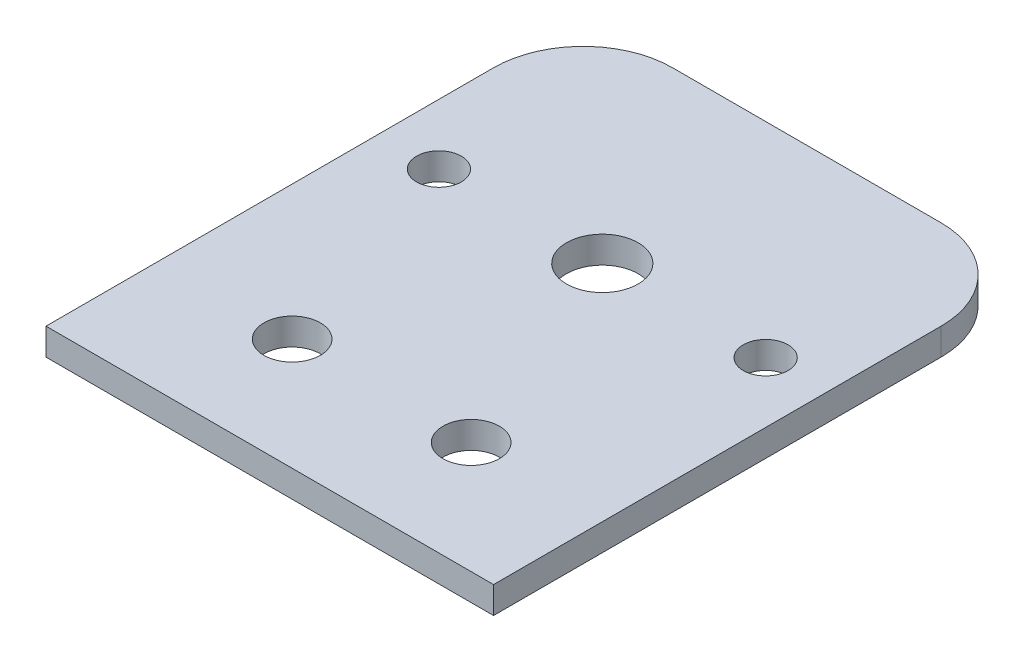
ISO-10303-21;
HEADER;
FILE_DESCRIPTION(('STEP AP214'),'2;1');
FILE_NAME('part.step','',(''),(''),'','','');
FILE_SCHEMA(('AUTOMOTIVE_DESIGN { 1 0 10303 214 1 1 1 1 }'));
ENDSEC;
DATA;
#1=APPLICATION_CONTEXT('core data for automotive mechanical design processes');
#2=APPLICATION_PROTOCOL_DEFINITION('international standard','automotive_design',2000,#1);
#3=PRODUCT_CONTEXT('',#1,'mechanical');
#4=PRODUCT('Part','Part','',(#3));
#5=PRODUCT_RELATED_PRODUCT_CATEGORY('part','',(#4));
#6=PRODUCT_DEFINITION_FORMATION('','',#4);
#7=PRODUCT_DEFINITION_CONTEXT('part definition',#1,'design');
#8=PRODUCT_DEFINITION('design','',#6,#7);
#9=PRODUCT_DEFINITION_SHAPE('','',#8);
#10=(LENGTH_UNIT() NAMED_UNIT(*) SI_UNIT(.MILLI.,.METRE.));
#11=(NAMED_UNIT(*) PLANE_ANGLE_UNIT() SI_UNIT($,.RADIAN.));
#12=(NAMED_UNIT(*) SI_UNIT($,.STERADIAN.) SOLID_ANGLE_UNIT());
#13=UNCERTAINTY_MEASURE_WITH_UNIT(LENGTH_MEASURE(1.E-05),#10,'distance_accuracy_value','');
#14=(GEOMETRIC_REPRESENTATION_CONTEXT(3) GLOBAL_UNCERTAINTY_ASSIGNED_CONTEXT((#13)) GLOBAL_UNIT_ASSIGNED_CONTEXT((#10,
#11,#12)) REPRESENTATION_CONTEXT('',''));
#15=CARTESIAN_POINT('',(0.,0.,0.));
#16=DIRECTION('',(0.,0.,1.));
#17=DIRECTION('',(1.,0.,0.));
#18=AXIS2_PLACEMENT_3D('',#15,#16,#17);
#19=CARTESIAN_POINT('',(15.,3.,-12.85));
#20=DIRECTION('',(0.,1.,0.));
#21=DIRECTION('',(0.,0.,1.));
#22=AXIS2_PLACEMENT_3D('',#19,#20,#21);
#23=PLANE('',#22);
#24=CARTESIAN_POINT('',(-18.25,3.,0.));
#25=DIRECTION('',(0.,1.,0.));
#26=DIRECTION('',(0.,0.,-1.));
#27=AXIS2_PLACEMENT_3D('',#24,#25,#26);
#28=CIRCLE('',#27,2.5);
#29=CARTESIAN_POINT('',(-18.25,3.,-2.5));
#30=VERTEX_POINT('',#29);
#31=EDGE_CURVE('E196',#30,#30,#28,.T.);
#32=ORIENTED_EDGE('',*,*,#31,.F.);
#33=EDGE_LOOP('',(#32));
#34=FACE_BOUND('',#33,.T.);
#35=CARTESIAN_POINT('',(18.25,3.,0.));
#36=DIRECTION('',(0.,1.,0.));
#37=DIRECTION('',(0.,0.,1.));
#38=AXIS2_PLACEMENT_3D('',#35,#36,#37);
#39=CIRCLE('',#38,2.5);
#40=CARTESIAN_POINT('',(18.25,3.,2.5));
#41=VERTEX_POINT('',#40);
#42=EDGE_CURVE('E208',#41,#41,#39,.T.);
#43=ORIENTED_EDGE('',*,*,#42,.F.);
#44=EDGE_LOOP('',(#43));
#45=FACE_BOUND('',#44,.T.);
#46=DIRECTION('',(0.,0.,-1.));
#47=VECTOR('',#46,1.);
#48=CARTESIAN_POINT('',(25.,3.,37.15));
#49=LINE('',#48,#47);
#50=CARTESIAN_POINT('',(25.,3.,37.15));
#51=VERTEX_POINT('',#50);
#52=CARTESIAN_POINT('',(25.,3.,-12.85));
#53=VERTEX_POINT('',#52);
#54=EDGE_CURVE('E132',#51,#53,#49,.T.);
#55=ORIENTED_EDGE('',*,*,#54,.T.);
#56=CARTESIAN_POINT('',(15.,3.,-12.85));
#57=DIRECTION('',(0.,1.,0.));
#58=DIRECTION('',(0.,0.,1.));
#59=AXIS2_PLACEMENT_3D('',#56,#57,#58);
#60=CIRCLE('',#59,10.);
#61=CARTESIAN_POINT('',(15.,3.,-22.85));
#62=VERTEX_POINT('',#61);
#63=EDGE_CURVE('E90',#53,#62,#60,.T.);
#64=ORIENTED_EDGE('',*,*,#63,.T.);
#65=DIRECTION('',(-1.,0.,0.));
#66=VECTOR('',#65,1.);
#67=CARTESIAN_POINT('',(15.,3.,-22.85));
#68=LINE('',#67,#66);
#69=CARTESIAN_POINT('',(-15.,3.,-22.85));
#70=VERTEX_POINT('',#69);
#71=EDGE_CURVE('E103',#62,#70,#68,.T.);
#72=ORIENTED_EDGE('',*,*,#71,.T.);
#73=CARTESIAN_POINT('',(-15.,3.,-12.85));
#74=DIRECTION('',(0.,1.,0.));
#75=DIRECTION('',(0.,0.,1.));
#76=AXIS2_PLACEMENT_3D('',#73,#74,#75);
#77=CIRCLE('',#76,10.);
#78=CARTESIAN_POINT('',(-25.,3.,-12.85));
#79=VERTEX_POINT('',#78);
#80=EDGE_CURVE('E97',#70,#79,#77,.T.);
#81=ORIENTED_EDGE('',*,*,#80,.T.);
#82=DIRECTION('',(0.,0.,1.));
#83=VECTOR('',#82,1.);
#84=CARTESIAN_POINT('',(-25.,3.,37.15));
#85=LINE('',#84,#83);
#86=CARTESIAN_POINT('',(-25.,3.,37.15));
#87=VERTEX_POINT('',#86);
#88=EDGE_CURVE('E101',#79,#87,#85,.T.);
#89=ORIENTED_EDGE('',*,*,#88,.T.);
#90=DIRECTION('',(1.,0.,0.));
#91=VECTOR('',#90,1.);
#92=CARTESIAN_POINT('',(25.,3.,37.15));
#93=LINE('',#92,#91);
#94=EDGE_CURVE('E53',#87,#51,#93,.T.);
#95=ORIENTED_EDGE('',*,*,#94,.T.);
#96=EDGE_LOOP('',(#55,#64,#72,#81,#89,#95));
#97=FACE_BOUND('',#96,.T.);
#98=CARTESIAN_POINT('',(0.,3.,0.));
#99=DIRECTION('',(0.,1.,0.));
#100=DIRECTION('',(0.,0.,1.));
#101=AXIS2_PLACEMENT_3D('',#98,#99,#100);
#102=CIRCLE('',#101,4.);
#103=CARTESIAN_POINT('',(0.,3.,4.));
#104=VERTEX_POINT('',#103);
#105=EDGE_CURVE('E125',#104,#104,#102,.T.);
#106=ORIENTED_EDGE('',*,*,#105,.F.);
#107=EDGE_LOOP('',(#106));
#108=FACE_BOUND('',#107,.T.);
#109=CARTESIAN_POINT('',(-10.,3.,24.65));
#110=DIRECTION('',(0.,1.,0.));
#111=DIRECTION('',(0.,0.,1.));
#112=AXIS2_PLACEMENT_3D('',#109,#110,#111);
#113=CIRCLE('',#112,3.15);
#114=CARTESIAN_POINT('',(-10.,3.,27.8));
#115=VERTEX_POINT('',#114);
#116=EDGE_CURVE('E202',#115,#115,#113,.T.);
#117=ORIENTED_EDGE('',*,*,#116,.F.);
#118=EDGE_LOOP('',(#117));
#119=FACE_BOUND('',#118,.T.);
#120=CARTESIAN_POINT('',(10.,3.,24.65));
#121=DIRECTION('',(0.,1.,0.));
#122=DIRECTION('',(0.,0.,-1.));
#123=AXIS2_PLACEMENT_3D('',#120,#121,#122);
#124=CIRCLE('',#123,3.15);
#125=CARTESIAN_POINT('',(10.,3.,21.5));
#126=VERTEX_POINT('',#125);
#127=EDGE_CURVE('E187',#126,#126,#124,.T.);
#128=ORIENTED_EDGE('',*,*,#127,.F.);
#129=EDGE_LOOP('',(#128));
#130=FACE_BOUND('',#129,.T.);
#131=ADVANCED_FACE('F36',(#34,#45,#97,#108,#119,#130),#23,.T.);
#132=CARTESIAN_POINT('',(15.,0.,-12.85));
#133=DIRECTION('',(0.,1.,0.));
#134=DIRECTION('',(0.,0.,1.));
#135=AXIS2_PLACEMENT_3D('',#132,#133,#134);
#136=PLANE('',#135);
#137=DIRECTION('',(0.,0.,-1.));
#138=VECTOR('',#137,1.);
#139=CARTESIAN_POINT('',(25.,0.,37.15));
#140=LINE('',#139,#138);
#141=CARTESIAN_POINT('',(25.,0.,37.15));
#142=VERTEX_POINT('',#141);
#143=CARTESIAN_POINT('',(25.,0.,-12.85));
#144=VERTEX_POINT('',#143);
#145=EDGE_CURVE('E121',#142,#144,#140,.T.);
#146=ORIENTED_EDGE('',*,*,#145,.F.);
#147=DIRECTION('',(1.,0.,0.));
#148=VECTOR('',#147,1.);
#149=CARTESIAN_POINT('',(25.,0.,37.15));
#150=LINE('',#149,#148);
#151=CARTESIAN_POINT('',(-25.,0.,37.15));
#152=VERTEX_POINT('',#151);
#153=EDGE_CURVE('E82',#152,#142,#150,.T.);
#154=ORIENTED_EDGE('',*,*,#153,.F.);
#155=DIRECTION('',(0.,0.,1.));
#156=VECTOR('',#155,1.);
#157=CARTESIAN_POINT('',(-25.,0.,37.15));
#158=LINE('',#157,#156);
#159=CARTESIAN_POINT('',(-25.,0.,-12.85));
#160=VERTEX_POINT('',#159);
#161=EDGE_CURVE('E76',#160,#152,#158,.T.);
#162=ORIENTED_EDGE('',*,*,#161,.F.);
#163=CARTESIAN_POINT('',(-15.,0.,-12.85));
#164=DIRECTION('',(0.,1.,0.));
#165=DIRECTION('',(0.,0.,1.));
#166=AXIS2_PLACEMENT_3D('',#163,#164,#165);
#167=CIRCLE('',#166,10.);
#168=CARTESIAN_POINT('',(-15.,0.,-22.85));
#169=VERTEX_POINT('',#168);
#170=EDGE_CURVE('E111',#169,#160,#167,.T.);
#171=ORIENTED_EDGE('',*,*,#170,.F.);
#172=DIRECTION('',(-1.,0.,0.));
#173=VECTOR('',#172,1.);
#174=CARTESIAN_POINT('',(15.,0.,-22.85));
#175=LINE('',#174,#173);
#176=CARTESIAN_POINT('',(15.,0.,-22.85));
#177=VERTEX_POINT('',#176);
#178=EDGE_CURVE('E127',#177,#169,#175,.T.);
#179=ORIENTED_EDGE('',*,*,#178,.F.);
#180=CARTESIAN_POINT('',(15.,0.,-12.85));
#181=DIRECTION('',(0.,1.,0.));
#182=DIRECTION('',(0.,0.,1.));
#183=AXIS2_PLACEMENT_3D('',#180,#181,#182);
#184=CIRCLE('',#183,10.);
#185=EDGE_CURVE('E124',#144,#177,#184,.T.);
#186=ORIENTED_EDGE('',*,*,#185,.F.);
#187=EDGE_LOOP('',(#146,#154,#162,#171,#179,#186));
#188=FACE_BOUND('',#187,.T.);
#189=CARTESIAN_POINT('',(0.,0.,0.));
#190=DIRECTION('',(0.,1.,0.));
#191=DIRECTION('',(0.,0.,1.));
#192=AXIS2_PLACEMENT_3D('',#189,#190,#191);
#193=CIRCLE('',#192,4.);
#194=CARTESIAN_POINT('',(0.,0.,4.));
#195=VERTEX_POINT('',#194);
#196=EDGE_CURVE('E211',#195,#195,#193,.T.);
#197=ORIENTED_EDGE('',*,*,#196,.T.);
#198=EDGE_LOOP('',(#197));
#199=FACE_BOUND('',#198,.T.);
#200=CARTESIAN_POINT('',(18.25,0.,0.));
#201=DIRECTION('',(0.,1.,0.));
#202=DIRECTION('',(0.,0.,1.));
#203=AXIS2_PLACEMENT_3D('',#200,#201,#202);
#204=CIRCLE('',#203,2.5);
#205=CARTESIAN_POINT('',(18.25,0.,2.5));
#206=VERTEX_POINT('',#205);
#207=EDGE_CURVE('E205',#206,#206,#204,.T.);
#208=ORIENTED_EDGE('',*,*,#207,.T.);
#209=EDGE_LOOP('',(#208));
#210=FACE_BOUND('',#209,.T.);
#211=CARTESIAN_POINT('',(-10.,0.,24.65));
#212=DIRECTION('',(0.,1.,0.));
#213=DIRECTION('',(0.,0.,1.));
#214=AXIS2_PLACEMENT_3D('',#211,#212,#213);
#215=CIRCLE('',#214,3.15);
#216=CARTESIAN_POINT('',(-10.,0.,27.8));
#217=VERTEX_POINT('',#216);
#218=EDGE_CURVE('E199',#217,#217,#215,.T.);
#219=ORIENTED_EDGE('',*,*,#218,.T.);
#220=EDGE_LOOP('',(#219));
#221=FACE_BOUND('',#220,.T.);
#222=CARTESIAN_POINT('',(-18.25,0.,0.));
#223=DIRECTION('',(0.,1.,0.));
#224=DIRECTION('',(0.,0.,-1.));
#225=AXIS2_PLACEMENT_3D('',#222,#223,#224);
#226=CIRCLE('',#225,2.5);
#227=CARTESIAN_POINT('',(-18.25,0.,-2.5));
#228=VERTEX_POINT('',#227);
#229=EDGE_CURVE('E193',#228,#228,#226,.T.);
#230=ORIENTED_EDGE('',*,*,#229,.T.);
#231=EDGE_LOOP('',(#230));
#232=FACE_BOUND('',#231,.T.);
#233=CARTESIAN_POINT('',(10.,0.,24.65));
#234=DIRECTION('',(0.,1.,0.));
#235=DIRECTION('',(0.,0.,-1.));
#236=AXIS2_PLACEMENT_3D('',#233,#234,#235);
#237=CIRCLE('',#236,3.15);
#238=CARTESIAN_POINT('',(10.,0.,21.5));
#239=VERTEX_POINT('',#238);
#240=EDGE_CURVE('E190',#239,#239,#237,.T.);
#241=ORIENTED_EDGE('',*,*,#240,.T.);
#242=EDGE_LOOP('',(#241));
#243=FACE_BOUND('',#242,.T.);
#244=ADVANCED_FACE('F141',(#188,#199,#210,#221,#232,#243),#136,.F.);
#245=CARTESIAN_POINT('',(25.,3.,37.15));
#246=DIRECTION('',(-1.,0.,0.));
#247=DIRECTION('',(0.,0.,1.));
#248=AXIS2_PLACEMENT_3D('',#245,#246,#247);
#249=PLANE('',#248);
#250=ORIENTED_EDGE('',*,*,#145,.T.);
#251=DIRECTION('',(0.,-1.,0.));
#252=VECTOR('',#251,1.);
#253=CARTESIAN_POINT('',(25.,3.,-12.85));
#254=LINE('',#253,#252);
#255=EDGE_CURVE('E11',#53,#144,#254,.T.);
#256=ORIENTED_EDGE('',*,*,#255,.F.);
#257=ORIENTED_EDGE('',*,*,#54,.F.);
#258=DIRECTION('',(0.,-1.,0.));
#259=VECTOR('',#258,1.);
#260=CARTESIAN_POINT('',(25.,3.,37.15));
#261=LINE('',#260,#259);
#262=EDGE_CURVE('E117',#51,#142,#261,.T.);
#263=ORIENTED_EDGE('',*,*,#262,.T.);
#264=EDGE_LOOP('',(#250,#256,#257,#263));
#265=FACE_BOUND('',#264,.T.);
#266=ADVANCED_FACE('F38',(#265),#249,.F.);
#267=CARTESIAN_POINT('',(15.,3.,-12.85));
#268=DIRECTION('',(0.,-1.,0.));
#269=DIRECTION('',(0.,0.,-1.));
#270=AXIS2_PLACEMENT_3D('',#267,#268,#269);
#271=CYLINDRICAL_SURFACE('',#270,10.);
#272=ORIENTED_EDGE('',*,*,#185,.T.);
#273=DIRECTION('',(0.,-1.,0.));
#274=VECTOR('',#273,1.);
#275=CARTESIAN_POINT('',(15.,3.,-22.85));
#276=LINE('',#275,#274);
#277=EDGE_CURVE('E45',#62,#177,#276,.T.);
#278=ORIENTED_EDGE('',*,*,#277,.F.);
#279=ORIENTED_EDGE('',*,*,#63,.F.);
#280=ORIENTED_EDGE('',*,*,#255,.T.);
#281=EDGE_LOOP('',(#272,#278,#279,#280));
#282=FACE_BOUND('',#281,.T.);
#283=ADVANCED_FACE('F278',(#282),#271,.T.);
#284=CARTESIAN_POINT('',(15.,3.,-22.85));
#285=DIRECTION('',(0.,0.,1.));
#286=DIRECTION('',(1.,0.,0.));
#287=AXIS2_PLACEMENT_3D('',#284,#285,#286);
#288=PLANE('',#287);
#289=ORIENTED_EDGE('',*,*,#178,.T.);
#290=DIRECTION('',(0.,-1.,0.));
#291=VECTOR('',#290,1.);
#292=CARTESIAN_POINT('',(-15.,3.,-22.85));
#293=LINE('',#292,#291);
#294=EDGE_CURVE('E112',#70,#169,#293,.T.);
#295=ORIENTED_EDGE('',*,*,#294,.F.);
#296=ORIENTED_EDGE('',*,*,#71,.F.);
#297=ORIENTED_EDGE('',*,*,#277,.T.);
#298=EDGE_LOOP('',(#289,#295,#296,#297));
#299=FACE_BOUND('',#298,.T.);
#300=ADVANCED_FACE('F138',(#299),#288,.F.);
#301=CARTESIAN_POINT('',(-15.,3.,-12.85));
#302=DIRECTION('',(0.,-1.,0.));
#303=DIRECTION('',(0.,0.,-1.));
#304=AXIS2_PLACEMENT_3D('',#301,#302,#303);
#305=CYLINDRICAL_SURFACE('',#304,10.);
#306=ORIENTED_EDGE('',*,*,#170,.T.);
#307=DIRECTION('',(0.,-1.,0.));
#308=VECTOR('',#307,1.);
#309=CARTESIAN_POINT('',(-25.,3.,-12.85));
#310=LINE('',#309,#308);
#311=EDGE_CURVE('E108',#79,#160,#310,.T.);
#312=ORIENTED_EDGE('',*,*,#311,.F.);
#313=ORIENTED_EDGE('',*,*,#80,.F.);
#314=ORIENTED_EDGE('',*,*,#294,.T.);
#315=EDGE_LOOP('',(#306,#312,#313,#314));
#316=FACE_BOUND('',#315,.T.);
#317=ADVANCED_FACE('F109',(#316),#305,.T.);
#318=CARTESIAN_POINT('',(-25.,3.,37.15));
#319=DIRECTION('',(1.,0.,0.));
#320=DIRECTION('',(0.,0.,-1.));
#321=AXIS2_PLACEMENT_3D('',#318,#319,#320);
#322=PLANE('',#321);
#323=ORIENTED_EDGE('',*,*,#161,.T.);
#324=DIRECTION('',(0.,-1.,0.));
#325=VECTOR('',#324,1.);
#326=CARTESIAN_POINT('',(-25.,3.,37.15));
#327=LINE('',#326,#325);
#328=EDGE_CURVE('E113',#87,#152,#327,.T.);
#329=ORIENTED_EDGE('',*,*,#328,.F.);
#330=ORIENTED_EDGE('',*,*,#88,.F.);
#331=ORIENTED_EDGE('',*,*,#311,.T.);
#332=EDGE_LOOP('',(#323,#329,#330,#331));
#333=FACE_BOUND('',#332,.T.);
#334=ADVANCED_FACE('F115',(#333),#322,.F.);
#335=CARTESIAN_POINT('',(25.,3.,37.15));
#336=DIRECTION('',(0.,0.,-1.));
#337=DIRECTION('',(-1.,0.,0.));
#338=AXIS2_PLACEMENT_3D('',#335,#336,#337);
#339=PLANE('',#338);
#340=ORIENTED_EDGE('',*,*,#153,.T.);
#341=ORIENTED_EDGE('',*,*,#262,.F.);
#342=ORIENTED_EDGE('',*,*,#94,.F.);
#343=ORIENTED_EDGE('',*,*,#328,.T.);
#344=EDGE_LOOP('',(#340,#341,#342,#343));
#345=FACE_BOUND('',#344,.T.);
#346=ADVANCED_FACE('F146',(#345),#339,.F.);
#347=CARTESIAN_POINT('',(0.,3.,0.));
#348=DIRECTION('',(0.,-1.,0.));
#349=DIRECTION('',(0.,0.,-1.));
#350=AXIS2_PLACEMENT_3D('',#347,#348,#349);
#351=CYLINDRICAL_SURFACE('',#350,4.);
#352=ORIENTED_EDGE('',*,*,#105,.T.);
#353=EDGE_LOOP('',(#352));
#354=FACE_BOUND('',#353,.T.);
#355=ORIENTED_EDGE('',*,*,#196,.F.);
#356=EDGE_LOOP('',(#355));
#357=FACE_BOUND('',#356,.T.);
#358=ADVANCED_FACE('F148',(#354,#357),#351,.F.);
#359=CARTESIAN_POINT('',(18.25,3.,0.));
#360=DIRECTION('',(0.,-1.,0.));
#361=DIRECTION('',(0.,0.,-1.));
#362=AXIS2_PLACEMENT_3D('',#359,#360,#361);
#363=CYLINDRICAL_SURFACE('',#362,2.5);
#364=ORIENTED_EDGE('',*,*,#42,.T.);
#365=EDGE_LOOP('',(#364));
#366=FACE_BOUND('',#365,.T.);
#367=ORIENTED_EDGE('',*,*,#207,.F.);
#368=EDGE_LOOP('',(#367));
#369=FACE_BOUND('',#368,.T.);
#370=ADVANCED_FACE('F154',(#366,#369),#363,.F.);
#371=CARTESIAN_POINT('',(-10.,3.,24.65));
#372=DIRECTION('',(0.,-1.,0.));
#373=DIRECTION('',(0.,0.,-1.));
#374=AXIS2_PLACEMENT_3D('',#371,#372,#373);
#375=CYLINDRICAL_SURFACE('',#374,3.15);
#376=ORIENTED_EDGE('',*,*,#116,.T.);
#377=EDGE_LOOP('',(#376));
#378=FACE_BOUND('',#377,.T.);
#379=ORIENTED_EDGE('',*,*,#218,.F.);
#380=EDGE_LOOP('',(#379));
#381=FACE_BOUND('',#380,.T.);
#382=ADVANCED_FACE('F170',(#378,#381),#375,.F.);
#383=CARTESIAN_POINT('',(-18.25,3.,0.));
#384=DIRECTION('',(0.,-1.,0.));
#385=DIRECTION('',(0.,0.,-1.));
#386=AXIS2_PLACEMENT_3D('',#383,#384,#385);
#387=CYLINDRICAL_SURFACE('',#386,2.5);
#388=ORIENTED_EDGE('',*,*,#31,.T.);
#389=EDGE_LOOP('',(#388));
#390=FACE_BOUND('',#389,.T.);
#391=ORIENTED_EDGE('',*,*,#229,.F.);
#392=EDGE_LOOP('',(#391));
#393=FACE_BOUND('',#392,.T.);
#394=ADVANCED_FACE('F174',(#390,#393),#387,.F.);
#395=CARTESIAN_POINT('',(10.,3.,24.65));
#396=DIRECTION('',(0.,-1.,0.));
#397=DIRECTION('',(0.,0.,-1.));
#398=AXIS2_PLACEMENT_3D('',#395,#396,#397);
#399=CYLINDRICAL_SURFACE('',#398,3.15);
#400=ORIENTED_EDGE('',*,*,#127,.T.);
#401=EDGE_LOOP('',(#400));
#402=FACE_BOUND('',#401,.T.);
#403=ORIENTED_EDGE('',*,*,#240,.F.);
#404=EDGE_LOOP('',(#403));
#405=FACE_BOUND('',#404,.T.);
#406=ADVANCED_FACE('F178',(#402,#405),#399,.F.);
#407=CLOSED_SHELL('',(#131,#244,#266,#283,#300,#317,#334,#346,#358,#370,#382,#394,#406));
#408=MANIFOLD_SOLID_BREP('B2',#407);
#409=ADVANCED_BREP_SHAPE_REPRESENTATION('',(#18,#408),#14);
#410=SHAPE_DEFINITION_REPRESENTATION(#9,#409);
ENDSEC;
END-ISO-10303-21;
